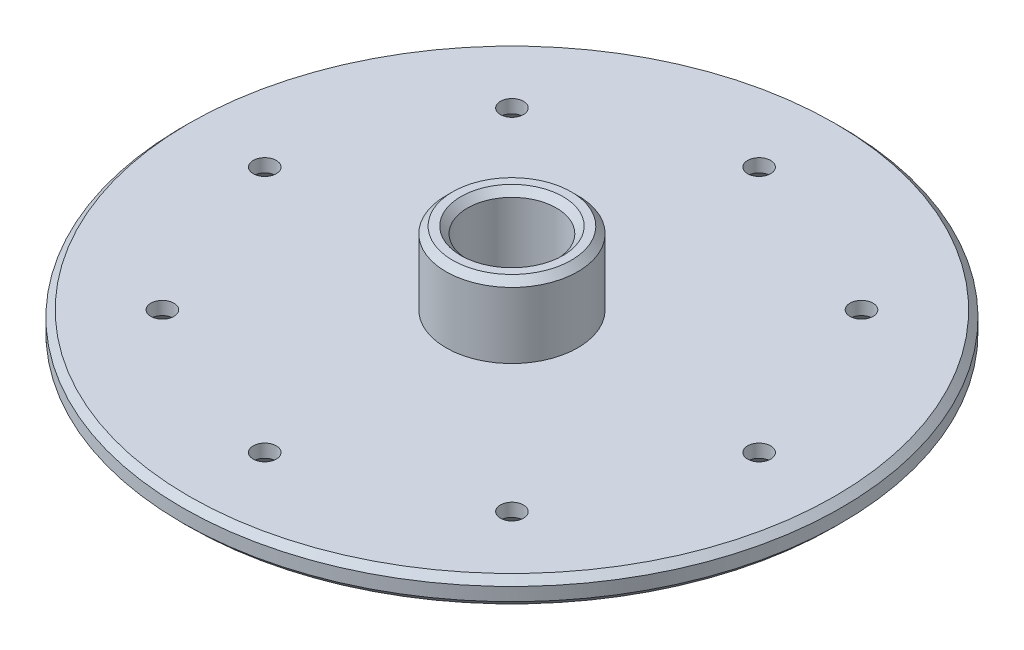
ISO-10303-21;
HEADER;
FILE_DESCRIPTION(('STEP AP214'),'2;1');
FILE_NAME('part.step','',(''),(''),'','','');
FILE_SCHEMA(('AUTOMOTIVE_DESIGN { 1 0 10303 214 1 1 1 1 }'));
ENDSEC;
DATA;
#1=APPLICATION_CONTEXT('core data for automotive mechanical design processes');
#2=APPLICATION_PROTOCOL_DEFINITION('international standard','automotive_design',2000,#1);
#3=PRODUCT_CONTEXT('',#1,'mechanical');
#4=PRODUCT('Part','Part','',(#3));
#5=PRODUCT_RELATED_PRODUCT_CATEGORY('part','',(#4));
#6=PRODUCT_DEFINITION_FORMATION('','',#4);
#7=PRODUCT_DEFINITION_CONTEXT('part definition',#1,'design');
#8=PRODUCT_DEFINITION('design','',#6,#7);
#9=PRODUCT_DEFINITION_SHAPE('','',#8);
#10=(LENGTH_UNIT() NAMED_UNIT(*) SI_UNIT(.MILLI.,.METRE.));
#11=(NAMED_UNIT(*) PLANE_ANGLE_UNIT() SI_UNIT($,.RADIAN.));
#12=(NAMED_UNIT(*) SI_UNIT($,.STERADIAN.) SOLID_ANGLE_UNIT());
#13=UNCERTAINTY_MEASURE_WITH_UNIT(LENGTH_MEASURE(1.E-05),#10,'distance_accuracy_value','');
#14=(GEOMETRIC_REPRESENTATION_CONTEXT(3) GLOBAL_UNCERTAINTY_ASSIGNED_CONTEXT((#13)) GLOBAL_UNIT_ASSIGNED_CONTEXT((#10,
#11,#12)) REPRESENTATION_CONTEXT('',''));
#15=CARTESIAN_POINT('',(0.,0.,0.));
#16=DIRECTION('',(0.,0.,1.));
#17=DIRECTION('',(1.,0.,0.));
#18=AXIS2_PLACEMENT_3D('',#15,#16,#17);
#19=CARTESIAN_POINT('',(0.,4.,9.99999999999998));
#20=DIRECTION('',(0.,1.,0.));
#21=DIRECTION('',(0.,0.,1.));
#22=AXIS2_PLACEMENT_3D('',#19,#20,#21);
#23=PLANE('',#22);
#24=CARTESIAN_POINT('',(0.,4.,-37.5));
#25=DIRECTION('',(0.,1.,0.));
#26=DIRECTION('',(0.,0.,1.));
#27=AXIS2_PLACEMENT_3D('',#24,#25,#26);
#28=CIRCLE('',#27,1.75);
#29=CARTESIAN_POINT('',(0.,4.,-35.75));
#30=VERTEX_POINT('',#29);
#31=EDGE_CURVE('E147',#30,#30,#28,.T.);
#32=ORIENTED_EDGE('',*,*,#31,.F.);
#33=EDGE_LOOP('',(#32));
#34=FACE_BOUND('',#33,.T.);
#35=CARTESIAN_POINT('',(26.5165042944955,4.,-26.5165042944955));
#36=DIRECTION('',(0.,1.,0.));
#37=DIRECTION('',(0.,0.,1.));
#38=AXIS2_PLACEMENT_3D('',#35,#36,#37);
#39=CIRCLE('',#38,1.75);
#40=CARTESIAN_POINT('',(26.5165042944955,4.,-24.7665042944955));
#41=VERTEX_POINT('',#40);
#42=EDGE_CURVE('E150',#41,#41,#39,.T.);
#43=ORIENTED_EDGE('',*,*,#42,.F.);
#44=EDGE_LOOP('',(#43));
#45=FACE_BOUND('',#44,.T.);
#46=CARTESIAN_POINT('',(37.5,4.,0.));
#47=DIRECTION('',(0.,1.,0.));
#48=DIRECTION('',(0.,0.,1.));
#49=AXIS2_PLACEMENT_3D('',#46,#47,#48);
#50=CIRCLE('',#49,1.75);
#51=CARTESIAN_POINT('',(37.5,4.,1.75));
#52=VERTEX_POINT('',#51);
#53=EDGE_CURVE('E153',#52,#52,#50,.T.);
#54=ORIENTED_EDGE('',*,*,#53,.F.);
#55=EDGE_LOOP('',(#54));
#56=FACE_BOUND('',#55,.T.);
#57=CARTESIAN_POINT('',(26.5165042944955,4.,26.5165042944955));
#58=DIRECTION('',(0.,1.,0.));
#59=DIRECTION('',(0.,0.,1.));
#60=AXIS2_PLACEMENT_3D('',#57,#58,#59);
#61=CIRCLE('',#60,1.75);
#62=CARTESIAN_POINT('',(26.5165042944955,4.,28.2665042944955));
#63=VERTEX_POINT('',#62);
#64=EDGE_CURVE('E156',#63,#63,#61,.T.);
#65=ORIENTED_EDGE('',*,*,#64,.F.);
#66=EDGE_LOOP('',(#65));
#67=FACE_BOUND('',#66,.T.);
#68=CARTESIAN_POINT('',(0.,4.,37.5));
#69=DIRECTION('',(0.,1.,0.));
#70=DIRECTION('',(0.,0.,1.));
#71=AXIS2_PLACEMENT_3D('',#68,#69,#70);
#72=CIRCLE('',#71,1.75);
#73=CARTESIAN_POINT('',(0.,4.,39.25));
#74=VERTEX_POINT('',#73);
#75=EDGE_CURVE('E159',#74,#74,#72,.T.);
#76=ORIENTED_EDGE('',*,*,#75,.F.);
#77=EDGE_LOOP('',(#76));
#78=FACE_BOUND('',#77,.T.);
#79=CARTESIAN_POINT('',(-26.5165042944955,4.,26.5165042944955));
#80=DIRECTION('',(0.,1.,0.));
#81=DIRECTION('',(0.,0.,1.));
#82=AXIS2_PLACEMENT_3D('',#79,#80,#81);
#83=CIRCLE('',#82,1.75);
#84=CARTESIAN_POINT('',(-26.5165042944955,4.,28.2665042944955));
#85=VERTEX_POINT('',#84);
#86=EDGE_CURVE('E162',#85,#85,#83,.T.);
#87=ORIENTED_EDGE('',*,*,#86,.F.);
#88=EDGE_LOOP('',(#87));
#89=FACE_BOUND('',#88,.T.);
#90=CARTESIAN_POINT('',(-37.5,4.,0.));
#91=DIRECTION('',(0.,1.,0.));
#92=DIRECTION('',(0.,0.,1.));
#93=AXIS2_PLACEMENT_3D('',#90,#91,#92);
#94=CIRCLE('',#93,1.75);
#95=CARTESIAN_POINT('',(-37.5,4.,1.75000000000001));
#96=VERTEX_POINT('',#95);
#97=EDGE_CURVE('E165',#96,#96,#94,.T.);
#98=ORIENTED_EDGE('',*,*,#97,.F.);
#99=EDGE_LOOP('',(#98));
#100=FACE_BOUND('',#99,.T.);
#101=CARTESIAN_POINT('',(-26.5165042944955,4.,-26.5165042944955));
#102=DIRECTION('',(0.,1.,0.));
#103=DIRECTION('',(0.,0.,1.));
#104=AXIS2_PLACEMENT_3D('',#101,#102,#103);
#105=CIRCLE('',#104,1.75);
#106=CARTESIAN_POINT('',(-26.5165042944955,4.,-24.7665042944955));
#107=VERTEX_POINT('',#106);
#108=EDGE_CURVE('E168',#107,#107,#105,.T.);
#109=ORIENTED_EDGE('',*,*,#108,.F.);
#110=EDGE_LOOP('',(#109));
#111=FACE_BOUND('',#110,.T.);
#112=CARTESIAN_POINT('',(0.,4.,0.));
#113=DIRECTION('',(0.,1.,0.));
#114=DIRECTION('',(0.,0.,1.));
#115=AXIS2_PLACEMENT_3D('',#112,#113,#114);
#116=CIRCLE('',#115,49.);
#117=CARTESIAN_POINT('',(0.,4.,49.));
#118=VERTEX_POINT('',#117);
#119=EDGE_CURVE('E90',#118,#118,#116,.T.);
#120=ORIENTED_EDGE('',*,*,#119,.T.);
#121=EDGE_LOOP('',(#120));
#122=FACE_BOUND('',#121,.T.);
#123=CARTESIAN_POINT('',(0.,4.,0.));
#124=DIRECTION('',(0.,1.,0.));
#125=DIRECTION('',(0.,0.,1.));
#126=AXIS2_PLACEMENT_3D('',#123,#124,#125);
#127=CIRCLE('',#126,9.99999999999998);
#128=CARTESIAN_POINT('',(0.,4.,9.99999999999998));
#129=VERTEX_POINT('',#128);
#130=EDGE_CURVE('E144',#129,#129,#127,.T.);
#131=ORIENTED_EDGE('',*,*,#130,.F.);
#132=EDGE_LOOP('',(#131));
#133=FACE_BOUND('',#132,.T.);
#134=ADVANCED_FACE('F33',(#34,#45,#56,#67,#78,#89,#100,#111,#122,#133),#23,.T.);
#135=CARTESIAN_POINT('',(0.,4.,0.));
#136=DIRECTION('',(0.,-1.,0.));
#137=DIRECTION('',(0.,0.,-1.));
#138=AXIS2_PLACEMENT_3D('',#135,#136,#137);
#139=CONICAL_SURFACE('',#138,49.,0.785398163397448);
#140=CARTESIAN_POINT('',(0.,3.,0.));
#141=DIRECTION('',(0.,1.,0.));
#142=DIRECTION('',(0.,0.,1.));
#143=AXIS2_PLACEMENT_3D('',#140,#141,#142);
#144=CIRCLE('',#143,50.);
#145=CARTESIAN_POINT('',(0.,3.,50.));
#146=VERTEX_POINT('',#145);
#147=EDGE_CURVE('E93',#146,#146,#144,.T.);
#148=ORIENTED_EDGE('',*,*,#147,.T.);
#149=EDGE_LOOP('',(#148));
#150=FACE_BOUND('',#149,.T.);
#151=ORIENTED_EDGE('',*,*,#119,.F.);
#152=EDGE_LOOP('',(#151));
#153=FACE_BOUND('',#152,.T.);
#154=ADVANCED_FACE('F176',(#150,#153),#139,.T.);
#155=CARTESIAN_POINT('',(0.,143.307692307691,0.));
#156=DIRECTION('',(0.,1.,0.));
#157=DIRECTION('',(0.,0.,1.));
#158=AXIS2_PLACEMENT_3D('',#155,#156,#157);
#159=CYLINDRICAL_SURFACE('',#158,50.);
#160=CARTESIAN_POINT('',(0.,1.,0.));
#161=DIRECTION('',(0.,1.,0.));
#162=DIRECTION('',(0.,0.,1.));
#163=AXIS2_PLACEMENT_3D('',#160,#161,#162);
#164=CIRCLE('',#163,50.);
#165=CARTESIAN_POINT('',(0.,1.,50.));
#166=VERTEX_POINT('',#165);
#167=EDGE_CURVE('E96',#166,#166,#164,.T.);
#168=ORIENTED_EDGE('',*,*,#167,.T.);
#169=EDGE_LOOP('',(#168));
#170=FACE_BOUND('',#169,.T.);
#171=ORIENTED_EDGE('',*,*,#147,.F.);
#172=EDGE_LOOP('',(#171));
#173=FACE_BOUND('',#172,.T.);
#174=ADVANCED_FACE('F277',(#170,#173),#159,.T.);
#175=CARTESIAN_POINT('',(0.,1.,0.));
#176=DIRECTION('',(0.,1.,0.));
#177=DIRECTION('',(0.,0.,1.));
#178=AXIS2_PLACEMENT_3D('',#175,#176,#177);
#179=CONICAL_SURFACE('',#178,50.,0.785398163397448);
#180=CARTESIAN_POINT('',(0.,0.,0.));
#181=DIRECTION('',(0.,1.,0.));
#182=DIRECTION('',(0.,0.,1.));
#183=AXIS2_PLACEMENT_3D('',#180,#181,#182);
#184=CIRCLE('',#183,49.);
#185=CARTESIAN_POINT('',(0.,0.,49.));
#186=VERTEX_POINT('',#185);
#187=EDGE_CURVE('E99',#186,#186,#184,.T.);
#188=ORIENTED_EDGE('',*,*,#187,.T.);
#189=EDGE_LOOP('',(#188));
#190=FACE_BOUND('',#189,.T.);
#191=ORIENTED_EDGE('',*,*,#167,.F.);
#192=EDGE_LOOP('',(#191));
#193=FACE_BOUND('',#192,.T.);
#194=ADVANCED_FACE('F270',(#190,#193),#179,.T.);
#195=CARTESIAN_POINT('',(0.,0.,49.));
#196=DIRECTION('',(0.,-1.,0.));
#197=DIRECTION('',(0.,0.,-1.));
#198=AXIS2_PLACEMENT_3D('',#195,#196,#197);
#199=PLANE('',#198);
#200=CARTESIAN_POINT('',(37.5,0.,0.));
#201=DIRECTION('',(0.,-1.,0.));
#202=DIRECTION('',(0.,0.,-1.));
#203=AXIS2_PLACEMENT_3D('',#200,#201,#202);
#204=CIRCLE('',#203,3.75000000000004);
#205=CARTESIAN_POINT('',(37.5,0.,-3.75000000000005));
#206=VERTEX_POINT('',#205);
#207=EDGE_CURVE('E63',#206,#206,#204,.F.);
#208=ORIENTED_EDGE('',*,*,#207,.T.);
#209=EDGE_LOOP('',(#208));
#210=FACE_BOUND('',#209,.T.);
#211=CARTESIAN_POINT('',(26.5165042944955,0.,26.5165042944955));
#212=DIRECTION('',(0.,-1.,0.));
#213=DIRECTION('',(0.,0.,-1.));
#214=AXIS2_PLACEMENT_3D('',#211,#212,#213);
#215=CIRCLE('',#214,3.75000000000004);
#216=CARTESIAN_POINT('',(26.5165042944955,0.,22.7665042944955));
#217=VERTEX_POINT('',#216);
#218=EDGE_CURVE('E66',#217,#217,#215,.F.);
#219=ORIENTED_EDGE('',*,*,#218,.T.);
#220=EDGE_LOOP('',(#219));
#221=FACE_BOUND('',#220,.T.);
#222=CARTESIAN_POINT('',(0.,0.,37.5));
#223=DIRECTION('',(0.,-1.,0.));
#224=DIRECTION('',(0.,0.,-1.));
#225=AXIS2_PLACEMENT_3D('',#222,#223,#224);
#226=CIRCLE('',#225,3.75000000000004);
#227=CARTESIAN_POINT('',(0.,0.,33.75));
#228=VERTEX_POINT('',#227);
#229=EDGE_CURVE('E69',#228,#228,#226,.F.);
#230=ORIENTED_EDGE('',*,*,#229,.T.);
#231=EDGE_LOOP('',(#230));
#232=FACE_BOUND('',#231,.T.);
#233=CARTESIAN_POINT('',(-26.5165042944955,0.,26.5165042944955));
#234=DIRECTION('',(0.,-1.,0.));
#235=DIRECTION('',(0.,0.,-1.));
#236=AXIS2_PLACEMENT_3D('',#233,#234,#235);
#237=CIRCLE('',#236,3.75000000000004);
#238=CARTESIAN_POINT('',(-26.5165042944955,0.,22.7665042944955));
#239=VERTEX_POINT('',#238);
#240=EDGE_CURVE('E72',#239,#239,#237,.F.);
#241=ORIENTED_EDGE('',*,*,#240,.T.);
#242=EDGE_LOOP('',(#241));
#243=FACE_BOUND('',#242,.T.);
#244=CARTESIAN_POINT('',(-37.5,0.,0.));
#245=DIRECTION('',(0.,-1.,0.));
#246=DIRECTION('',(0.,0.,-1.));
#247=AXIS2_PLACEMENT_3D('',#244,#245,#246);
#248=CIRCLE('',#247,3.75000000000004);
#249=CARTESIAN_POINT('',(-37.5,0.,-3.75000000000004));
#250=VERTEX_POINT('',#249);
#251=EDGE_CURVE('E75',#250,#250,#248,.F.);
#252=ORIENTED_EDGE('',*,*,#251,.T.);
#253=EDGE_LOOP('',(#252));
#254=FACE_BOUND('',#253,.T.);
#255=CARTESIAN_POINT('',(-26.5165042944955,0.,-26.5165042944955));
#256=DIRECTION('',(0.,-1.,0.));
#257=DIRECTION('',(0.,0.,-1.));
#258=AXIS2_PLACEMENT_3D('',#255,#256,#257);
#259=CIRCLE('',#258,3.75000000000004);
#260=CARTESIAN_POINT('',(-26.5165042944955,0.,-30.2665042944956));
#261=VERTEX_POINT('',#260);
#262=EDGE_CURVE('E78',#261,#261,#259,.F.);
#263=ORIENTED_EDGE('',*,*,#262,.T.);
#264=EDGE_LOOP('',(#263));
#265=FACE_BOUND('',#264,.T.);
#266=CARTESIAN_POINT('',(26.5165042944955,0.,-26.5165042944955));
#267=DIRECTION('',(0.,-1.,0.));
#268=DIRECTION('',(0.,0.,-1.));
#269=AXIS2_PLACEMENT_3D('',#266,#267,#268);
#270=CIRCLE('',#269,3.75000000000004);
#271=CARTESIAN_POINT('',(26.5165042944955,0.,-30.2665042944956));
#272=VERTEX_POINT('',#271);
#273=EDGE_CURVE('E81',#272,#272,#270,.F.);
#274=ORIENTED_EDGE('',*,*,#273,.T.);
#275=EDGE_LOOP('',(#274));
#276=FACE_BOUND('',#275,.T.);
#277=CARTESIAN_POINT('',(0.,0.,-37.5));
#278=DIRECTION('',(0.,-1.,0.));
#279=DIRECTION('',(0.,0.,-1.));
#280=AXIS2_PLACEMENT_3D('',#277,#278,#279);
#281=CIRCLE('',#280,3.75000000000004);
#282=CARTESIAN_POINT('',(0.,0.,-41.25));
#283=VERTEX_POINT('',#282);
#284=EDGE_CURVE('E84',#283,#283,#281,.F.);
#285=ORIENTED_EDGE('',*,*,#284,.T.);
#286=EDGE_LOOP('',(#285));
#287=FACE_BOUND('',#286,.T.);
#288=CARTESIAN_POINT('',(0.,0.,0.));
#289=DIRECTION('',(0.,1.,0.));
#290=DIRECTION('',(0.,0.,1.));
#291=AXIS2_PLACEMENT_3D('',#288,#289,#290);
#292=CIRCLE('',#291,19.);
#293=CARTESIAN_POINT('',(0.,0.,19.));
#294=VERTEX_POINT('',#293);
#295=EDGE_CURVE('E102',#294,#294,#292,.T.);
#296=ORIENTED_EDGE('',*,*,#295,.T.);
#297=EDGE_LOOP('',(#296));
#298=FACE_BOUND('',#297,.T.);
#299=ORIENTED_EDGE('',*,*,#187,.F.);
#300=EDGE_LOOP('',(#299));
#301=FACE_BOUND('',#300,.T.);
#302=ADVANCED_FACE('F264',(#210,#221,#232,#243,#254,#265,#276,#287,#298,#301),#199,.T.);
#303=CARTESIAN_POINT('',(0.,0.,0.));
#304=DIRECTION('',(0.,1.,0.));
#305=DIRECTION('',(0.,0.,1.));
#306=AXIS2_PLACEMENT_3D('',#303,#304,#305);
#307=CONICAL_SURFACE('',#306,19.,0.785398163397448);
#308=CARTESIAN_POINT('',(0.,-1.,0.));
#309=DIRECTION('',(0.,1.,0.));
#310=DIRECTION('',(0.,0.,1.));
#311=AXIS2_PLACEMENT_3D('',#308,#309,#310);
#312=CIRCLE('',#311,18.);
#313=CARTESIAN_POINT('',(0.,-1.,18.));
#314=VERTEX_POINT('',#313);
#315=EDGE_CURVE('E105',#314,#314,#312,.T.);
#316=ORIENTED_EDGE('',*,*,#315,.T.);
#317=EDGE_LOOP('',(#316));
#318=FACE_BOUND('',#317,.T.);
#319=ORIENTED_EDGE('',*,*,#295,.F.);
#320=EDGE_LOOP('',(#319));
#321=FACE_BOUND('',#320,.T.);
#322=ADVANCED_FACE('F258',(#318,#321),#307,.T.);
#323=CARTESIAN_POINT('',(0.,143.307692307691,0.));
#324=DIRECTION('',(0.,1.,0.));
#325=DIRECTION('',(0.,0.,1.));
#326=AXIS2_PLACEMENT_3D('',#323,#324,#325);
#327=CYLINDRICAL_SURFACE('',#326,18.);
#328=CARTESIAN_POINT('',(0.,-14.,0.));
#329=DIRECTION('',(0.,1.,0.));
#330=DIRECTION('',(0.,0.,1.));
#331=AXIS2_PLACEMENT_3D('',#328,#329,#330);
#332=CIRCLE('',#331,18.);
#333=CARTESIAN_POINT('',(0.,-14.,18.));
#334=VERTEX_POINT('',#333);
#335=EDGE_CURVE('E108',#334,#334,#332,.T.);
#336=ORIENTED_EDGE('',*,*,#335,.T.);
#337=EDGE_LOOP('',(#336));
#338=FACE_BOUND('',#337,.T.);
#339=ORIENTED_EDGE('',*,*,#315,.F.);
#340=EDGE_LOOP('',(#339));
#341=FACE_BOUND('',#340,.T.);
#342=ADVANCED_FACE('F252',(#338,#341),#327,.T.);
#343=CARTESIAN_POINT('',(0.,-14.,0.));
#344=DIRECTION('',(0.,1.,0.));
#345=DIRECTION('',(0.,0.,1.));
#346=AXIS2_PLACEMENT_3D('',#343,#344,#345);
#347=CONICAL_SURFACE('',#346,18.,0.785398163397448);
#348=CARTESIAN_POINT('',(0.,-15.,0.));
#349=DIRECTION('',(0.,1.,0.));
#350=DIRECTION('',(0.,0.,1.));
#351=AXIS2_PLACEMENT_3D('',#348,#349,#350);
#352=CIRCLE('',#351,17.);
#353=CARTESIAN_POINT('',(0.,-15.,17.));
#354=VERTEX_POINT('',#353);
#355=EDGE_CURVE('E111',#354,#354,#352,.T.);
#356=ORIENTED_EDGE('',*,*,#355,.T.);
#357=EDGE_LOOP('',(#356));
#358=FACE_BOUND('',#357,.T.);
#359=ORIENTED_EDGE('',*,*,#335,.F.);
#360=EDGE_LOOP('',(#359));
#361=FACE_BOUND('',#360,.T.);
#362=ADVANCED_FACE('F246',(#358,#361),#347,.T.);
#363=CARTESIAN_POINT('',(0.,-15.,17.));
#364=DIRECTION('',(0.,-1.,0.));
#365=DIRECTION('',(0.,0.,-1.));
#366=AXIS2_PLACEMENT_3D('',#363,#364,#365);
#367=PLANE('',#366);
#368=CARTESIAN_POINT('',(0.,-15.,0.));
#369=DIRECTION('',(0.,1.,0.));
#370=DIRECTION('',(0.,0.,1.));
#371=AXIS2_PLACEMENT_3D('',#368,#369,#370);
#372=CIRCLE('',#371,15.25);
#373=CARTESIAN_POINT('',(0.,-15.,15.25));
#374=VERTEX_POINT('',#373);
#375=EDGE_CURVE('E114',#374,#374,#372,.T.);
#376=ORIENTED_EDGE('',*,*,#375,.T.);
#377=EDGE_LOOP('',(#376));
#378=FACE_BOUND('',#377,.T.);
#379=ORIENTED_EDGE('',*,*,#355,.F.);
#380=EDGE_LOOP('',(#379));
#381=FACE_BOUND('',#380,.T.);
#382=ADVANCED_FACE('F240',(#378,#381),#367,.T.);
#383=CARTESIAN_POINT('',(0.,-15.,0.));
#384=DIRECTION('',(0.,-1.,0.));
#385=DIRECTION('',(0.,0.,-1.));
#386=AXIS2_PLACEMENT_3D('',#383,#384,#385);
#387=CONICAL_SURFACE('',#386,15.25,0.785398163397447);
#388=CARTESIAN_POINT('',(0.,-14.,0.));
#389=DIRECTION('',(0.,1.,0.));
#390=DIRECTION('',(0.,0.,1.));
#391=AXIS2_PLACEMENT_3D('',#388,#389,#390);
#392=CIRCLE('',#391,14.25);
#393=CARTESIAN_POINT('',(0.,-14.,14.25));
#394=VERTEX_POINT('',#393);
#395=EDGE_CURVE('E117',#394,#394,#392,.T.);
#396=ORIENTED_EDGE('',*,*,#395,.T.);
#397=EDGE_LOOP('',(#396));
#398=FACE_BOUND('',#397,.T.);
#399=ORIENTED_EDGE('',*,*,#375,.F.);
#400=EDGE_LOOP('',(#399));
#401=FACE_BOUND('',#400,.T.);
#402=ADVANCED_FACE('F234',(#398,#401),#387,.F.);
#403=CARTESIAN_POINT('',(0.,143.307692307691,0.));
#404=DIRECTION('',(0.,1.,0.));
#405=DIRECTION('',(0.,0.,1.));
#406=AXIS2_PLACEMENT_3D('',#403,#404,#405);
#407=CYLINDRICAL_SURFACE('',#406,14.25);
#408=CARTESIAN_POINT('',(0.,-5.09999999999999,0.));
#409=DIRECTION('',(0.,1.,0.));
#410=DIRECTION('',(0.,0.,1.));
#411=AXIS2_PLACEMENT_3D('',#408,#409,#410);
#412=CIRCLE('',#411,14.25);
#413=CARTESIAN_POINT('',(0.,-5.09999999999999,14.25));
#414=VERTEX_POINT('',#413);
#415=EDGE_CURVE('E120',#414,#414,#412,.T.);
#416=ORIENTED_EDGE('',*,*,#415,.T.);
#417=EDGE_LOOP('',(#416));
#418=FACE_BOUND('',#417,.T.);
#419=ORIENTED_EDGE('',*,*,#395,.F.);
#420=EDGE_LOOP('',(#419));
#421=FACE_BOUND('',#420,.T.);
#422=ADVANCED_FACE('F228',(#418,#421),#407,.F.);
#423=CARTESIAN_POINT('',(0.,-5.09999999999999,0.));
#424=DIRECTION('',(0.,-1.,0.));
#425=DIRECTION('',(0.,0.,-1.));
#426=AXIS2_PLACEMENT_3D('',#423,#424,#425);
#427=CONICAL_SURFACE('',#426,14.25,0.7853981633975);
#428=CARTESIAN_POINT('',(0.,-5.,0.));
#429=DIRECTION('',(0.,1.,0.));
#430=DIRECTION('',(0.,0.,1.));
#431=AXIS2_PLACEMENT_3D('',#428,#429,#430);
#432=CIRCLE('',#431,14.15);
#433=CARTESIAN_POINT('',(0.,-5.,14.15));
#434=VERTEX_POINT('',#433);
#435=EDGE_CURVE('E123',#434,#434,#432,.T.);
#436=ORIENTED_EDGE('',*,*,#435,.T.);
#437=EDGE_LOOP('',(#436));
#438=FACE_BOUND('',#437,.T.);
#439=ORIENTED_EDGE('',*,*,#415,.F.);
#440=EDGE_LOOP('',(#439));
#441=FACE_BOUND('',#440,.T.);
#442=ADVANCED_FACE('F222',(#438,#441),#427,.F.);
#443=CARTESIAN_POINT('',(0.,-5.,11.75));
#444=DIRECTION('',(0.,-1.,0.));
#445=DIRECTION('',(0.,0.,-1.));
#446=AXIS2_PLACEMENT_3D('',#443,#444,#445);
#447=PLANE('',#446);
#448=CARTESIAN_POINT('',(0.,-5.,0.));
#449=DIRECTION('',(0.,1.,0.));
#450=DIRECTION('',(0.,0.,1.));
#451=AXIS2_PLACEMENT_3D('',#448,#449,#450);
#452=CIRCLE('',#451,11.75);
#453=CARTESIAN_POINT('',(0.,-5.,11.75));
#454=VERTEX_POINT('',#453);
#455=EDGE_CURVE('E126',#454,#454,#452,.T.);
#456=ORIENTED_EDGE('',*,*,#455,.T.);
#457=EDGE_LOOP('',(#456));
#458=FACE_BOUND('',#457,.T.);
#459=ORIENTED_EDGE('',*,*,#435,.F.);
#460=EDGE_LOOP('',(#459));
#461=FACE_BOUND('',#460,.T.);
#462=ADVANCED_FACE('F216',(#458,#461),#447,.T.);
#463=CARTESIAN_POINT('',(0.,-5.,0.));
#464=DIRECTION('',(0.,-1.,0.));
#465=DIRECTION('',(0.,0.,-1.));
#466=AXIS2_PLACEMENT_3D('',#463,#464,#465);
#467=CONICAL_SURFACE('',#466,11.75,0.785398163397445);
#468=CARTESIAN_POINT('',(0.,0.,0.));
#469=DIRECTION('',(0.,1.,0.));
#470=DIRECTION('',(0.,0.,1.));
#471=AXIS2_PLACEMENT_3D('',#468,#469,#470);
#472=CIRCLE('',#471,6.74999999999998);
#473=CARTESIAN_POINT('',(0.,0.,6.74999999999998));
#474=VERTEX_POINT('',#473);
#475=EDGE_CURVE('E129',#474,#474,#472,.T.);
#476=ORIENTED_EDGE('',*,*,#475,.T.);
#477=EDGE_LOOP('',(#476));
#478=FACE_BOUND('',#477,.T.);
#479=ORIENTED_EDGE('',*,*,#455,.F.);
#480=EDGE_LOOP('',(#479));
#481=FACE_BOUND('',#480,.T.);
#482=ADVANCED_FACE('F210',(#478,#481),#467,.F.);
#483=CARTESIAN_POINT('',(0.,143.307692307691,0.));
#484=DIRECTION('',(0.,1.,0.));
#485=DIRECTION('',(0.,0.,1.));
#486=AXIS2_PLACEMENT_3D('',#483,#484,#485);
#487=CYLINDRICAL_SURFACE('',#486,6.74999999999998);
#488=CARTESIAN_POINT('',(0.,14.,0.));
#489=DIRECTION('',(0.,1.,0.));
#490=DIRECTION('',(0.,0.,1.));
#491=AXIS2_PLACEMENT_3D('',#488,#489,#490);
#492=CIRCLE('',#491,6.74999999999998);
#493=CARTESIAN_POINT('',(0.,14.,6.74999999999998));
#494=VERTEX_POINT('',#493);
#495=EDGE_CURVE('E132',#494,#494,#492,.T.);
#496=ORIENTED_EDGE('',*,*,#495,.T.);
#497=EDGE_LOOP('',(#496));
#498=FACE_BOUND('',#497,.T.);
#499=ORIENTED_EDGE('',*,*,#475,.F.);
#500=EDGE_LOOP('',(#499));
#501=FACE_BOUND('',#500,.T.);
#502=ADVANCED_FACE('F204',(#498,#501),#487,.F.);
#503=CARTESIAN_POINT('',(0.,14.,0.));
#504=DIRECTION('',(0.,1.,0.));
#505=DIRECTION('',(0.,0.,1.));
#506=AXIS2_PLACEMENT_3D('',#503,#504,#505);
#507=CONICAL_SURFACE('',#506,6.74999999999998,0.785398163397448);
#508=CARTESIAN_POINT('',(0.,15.,0.));
#509=DIRECTION('',(0.,1.,0.));
#510=DIRECTION('',(0.,0.,1.));
#511=AXIS2_PLACEMENT_3D('',#508,#509,#510);
#512=CIRCLE('',#511,7.74999999999998);
#513=CARTESIAN_POINT('',(0.,15.,7.74999999999998));
#514=VERTEX_POINT('',#513);
#515=EDGE_CURVE('E135',#514,#514,#512,.T.);
#516=ORIENTED_EDGE('',*,*,#515,.T.);
#517=EDGE_LOOP('',(#516));
#518=FACE_BOUND('',#517,.T.);
#519=ORIENTED_EDGE('',*,*,#495,.F.);
#520=EDGE_LOOP('',(#519));
#521=FACE_BOUND('',#520,.T.);
#522=ADVANCED_FACE('F198',(#518,#521),#507,.F.);
#523=CARTESIAN_POINT('',(0.,15.,7.74999999999998));
#524=DIRECTION('',(0.,1.,0.));
#525=DIRECTION('',(0.,0.,1.));
#526=AXIS2_PLACEMENT_3D('',#523,#524,#525);
#527=PLANE('',#526);
#528=CARTESIAN_POINT('',(0.,15.,0.));
#529=DIRECTION('',(0.,1.,0.));
#530=DIRECTION('',(0.,0.,1.));
#531=AXIS2_PLACEMENT_3D('',#528,#529,#530);
#532=CIRCLE('',#531,8.99999999999999);
#533=CARTESIAN_POINT('',(0.,15.,8.99999999999999));
#534=VERTEX_POINT('',#533);
#535=EDGE_CURVE('E138',#534,#534,#532,.T.);
#536=ORIENTED_EDGE('',*,*,#535,.T.);
#537=EDGE_LOOP('',(#536));
#538=FACE_BOUND('',#537,.T.);
#539=ORIENTED_EDGE('',*,*,#515,.F.);
#540=EDGE_LOOP('',(#539));
#541=FACE_BOUND('',#540,.T.);
#542=ADVANCED_FACE('F192',(#538,#541),#527,.T.);
#543=CARTESIAN_POINT('',(0.,15.,0.));
#544=DIRECTION('',(0.,-1.,0.));
#545=DIRECTION('',(0.,0.,-1.));
#546=AXIS2_PLACEMENT_3D('',#543,#544,#545);
#547=CONICAL_SURFACE('',#546,8.99999999999999,0.785398163397447);
#548=CARTESIAN_POINT('',(0.,14.,0.));
#549=DIRECTION('',(0.,1.,0.));
#550=DIRECTION('',(0.,0.,1.));
#551=AXIS2_PLACEMENT_3D('',#548,#549,#550);
#552=CIRCLE('',#551,9.99999999999998);
#553=CARTESIAN_POINT('',(0.,14.,9.99999999999998));
#554=VERTEX_POINT('',#553);
#555=EDGE_CURVE('E141',#554,#554,#552,.T.);
#556=ORIENTED_EDGE('',*,*,#555,.T.);
#557=EDGE_LOOP('',(#556));
#558=FACE_BOUND('',#557,.T.);
#559=ORIENTED_EDGE('',*,*,#535,.F.);
#560=EDGE_LOOP('',(#559));
#561=FACE_BOUND('',#560,.T.);
#562=ADVANCED_FACE('F186',(#558,#561),#547,.T.);
#563=CARTESIAN_POINT('',(0.,143.307692307691,0.));
#564=DIRECTION('',(0.,1.,0.));
#565=DIRECTION('',(0.,0.,1.));
#566=AXIS2_PLACEMENT_3D('',#563,#564,#565);
#567=CYLINDRICAL_SURFACE('',#566,9.99999999999998);
#568=ORIENTED_EDGE('',*,*,#130,.T.);
#569=EDGE_LOOP('',(#568));
#570=FACE_BOUND('',#569,.T.);
#571=ORIENTED_EDGE('',*,*,#555,.F.);
#572=EDGE_LOOP('',(#571));
#573=FACE_BOUND('',#572,.T.);
#574=ADVANCED_FACE('F183',(#570,#573),#567,.T.);
#575=CARTESIAN_POINT('',(-26.5165042944955,-15.,-26.5165042944955));
#576=DIRECTION('',(0.,1.,0.));
#577=DIRECTION('',(0.,0.,1.));
#578=AXIS2_PLACEMENT_3D('',#575,#576,#577);
#579=CYLINDRICAL_SURFACE('',#578,1.75);
#580=CARTESIAN_POINT('',(-26.5165042944955,2.00000000000004,-26.5165042944955));
#581=DIRECTION('',(0.,-1.,0.));
#582=DIRECTION('',(0.,0.,-1.));
#583=AXIS2_PLACEMENT_3D('',#580,#581,#582);
#584=CIRCLE('',#583,1.75);
#585=CARTESIAN_POINT('',(-26.5165042944955,2.00000000000004,-28.2665042944955));
#586=VERTEX_POINT('',#585);
#587=EDGE_CURVE('E45',#586,#586,#584,.T.);
#588=ORIENTED_EDGE('',*,*,#587,.T.);
#589=EDGE_LOOP('',(#588));
#590=FACE_BOUND('',#589,.T.);
#591=ORIENTED_EDGE('',*,*,#108,.T.);
#592=EDGE_LOOP('',(#591));
#593=FACE_BOUND('',#592,.T.);
#594=ADVANCED_FACE('F172',(#590,#593),#579,.F.);
#595=CARTESIAN_POINT('',(-37.5,-15.,0.));
#596=DIRECTION('',(0.,1.,0.));
#597=DIRECTION('',(0.,0.,1.));
#598=AXIS2_PLACEMENT_3D('',#595,#596,#597);
#599=CYLINDRICAL_SURFACE('',#598,1.75);
#600=CARTESIAN_POINT('',(-37.5,2.00000000000003,0.));
#601=DIRECTION('',(0.,-1.,0.));
#602=DIRECTION('',(0.,0.,-1.));
#603=AXIS2_PLACEMENT_3D('',#600,#601,#602);
#604=CIRCLE('',#603,1.75);
#605=CARTESIAN_POINT('',(-37.5,2.00000000000003,-1.75));
#606=VERTEX_POINT('',#605);
#607=EDGE_CURVE('E49',#606,#606,#604,.T.);
#608=ORIENTED_EDGE('',*,*,#607,.T.);
#609=EDGE_LOOP('',(#608));
#610=FACE_BOUND('',#609,.T.);
#611=ORIENTED_EDGE('',*,*,#97,.T.);
#612=EDGE_LOOP('',(#611));
#613=FACE_BOUND('',#612,.T.);
#614=ADVANCED_FACE('F449',(#610,#613),#599,.F.);
#615=CARTESIAN_POINT('',(-26.5165042944955,-15.,26.5165042944955));
#616=DIRECTION('',(0.,1.,0.));
#617=DIRECTION('',(0.,0.,1.));
#618=AXIS2_PLACEMENT_3D('',#615,#616,#617);
#619=CYLINDRICAL_SURFACE('',#618,1.75);
#620=CARTESIAN_POINT('',(-26.5165042944955,2.00000000000004,26.5165042944955));
#621=DIRECTION('',(0.,-1.,0.));
#622=DIRECTION('',(0.,0.,-1.));
#623=AXIS2_PLACEMENT_3D('',#620,#621,#622);
#624=CIRCLE('',#623,1.75);
#625=CARTESIAN_POINT('',(-26.5165042944955,2.00000000000004,24.7665042944955));
#626=VERTEX_POINT('',#625);
#627=EDGE_CURVE('E54',#626,#626,#624,.T.);
#628=ORIENTED_EDGE('',*,*,#627,.T.);
#629=EDGE_LOOP('',(#628));
#630=FACE_BOUND('',#629,.T.);
#631=ORIENTED_EDGE('',*,*,#86,.T.);
#632=EDGE_LOOP('',(#631));
#633=FACE_BOUND('',#632,.T.);
#634=ADVANCED_FACE('F439',(#630,#633),#619,.F.);
#635=CARTESIAN_POINT('',(0.,-15.,37.5));
#636=DIRECTION('',(0.,1.,0.));
#637=DIRECTION('',(0.,0.,1.));
#638=AXIS2_PLACEMENT_3D('',#635,#636,#637);
#639=CYLINDRICAL_SURFACE('',#638,1.75);
#640=CARTESIAN_POINT('',(0.,2.00000000000004,37.5));
#641=DIRECTION('',(0.,-1.,0.));
#642=DIRECTION('',(0.,0.,-1.));
#643=AXIS2_PLACEMENT_3D('',#640,#641,#642);
#644=CIRCLE('',#643,1.75);
#645=CARTESIAN_POINT('',(0.,2.00000000000004,35.75));
#646=VERTEX_POINT('',#645);
#647=EDGE_CURVE('E57',#646,#646,#644,.T.);
#648=ORIENTED_EDGE('',*,*,#647,.T.);
#649=EDGE_LOOP('',(#648));
#650=FACE_BOUND('',#649,.T.);
#651=ORIENTED_EDGE('',*,*,#75,.T.);
#652=EDGE_LOOP('',(#651));
#653=FACE_BOUND('',#652,.T.);
#654=ADVANCED_FACE('F429',(#650,#653),#639,.F.);
#655=CARTESIAN_POINT('',(26.5165042944955,-15.,26.5165042944955));
#656=DIRECTION('',(0.,1.,0.));
#657=DIRECTION('',(0.,0.,1.));
#658=AXIS2_PLACEMENT_3D('',#655,#656,#657);
#659=CYLINDRICAL_SURFACE('',#658,1.75);
#660=CARTESIAN_POINT('',(26.5165042944955,2.00000000000004,26.5165042944955));
#661=DIRECTION('',(0.,-1.,0.));
#662=DIRECTION('',(0.,0.,-1.));
#663=AXIS2_PLACEMENT_3D('',#660,#661,#662);
#664=CIRCLE('',#663,1.75);
#665=CARTESIAN_POINT('',(26.5165042944955,2.00000000000004,24.7665042944955));
#666=VERTEX_POINT('',#665);
#667=EDGE_CURVE('E60',#666,#666,#664,.T.);
#668=ORIENTED_EDGE('',*,*,#667,.T.);
#669=EDGE_LOOP('',(#668));
#670=FACE_BOUND('',#669,.T.);
#671=ORIENTED_EDGE('',*,*,#64,.T.);
#672=EDGE_LOOP('',(#671));
#673=FACE_BOUND('',#672,.T.);
#674=ADVANCED_FACE('F419',(#670,#673),#659,.F.);
#675=CARTESIAN_POINT('',(37.5,-15.,0.));
#676=DIRECTION('',(0.,1.,0.));
#677=DIRECTION('',(0.,0.,1.));
#678=AXIS2_PLACEMENT_3D('',#675,#676,#677);
#679=CYLINDRICAL_SURFACE('',#678,1.75);
#680=CARTESIAN_POINT('',(37.5,2.00000000000003,0.));
#681=DIRECTION('',(0.,-1.,0.));
#682=DIRECTION('',(0.,0.,-1.));
#683=AXIS2_PLACEMENT_3D('',#680,#681,#682);
#684=CIRCLE('',#683,1.75);
#685=CARTESIAN_POINT('',(37.5,2.00000000000003,-1.75000000000001));
#686=VERTEX_POINT('',#685);
#687=EDGE_CURVE('E87',#686,#686,#684,.T.);
#688=ORIENTED_EDGE('',*,*,#687,.T.);
#689=EDGE_LOOP('',(#688));
#690=FACE_BOUND('',#689,.T.);
#691=ORIENTED_EDGE('',*,*,#53,.T.);
#692=EDGE_LOOP('',(#691));
#693=FACE_BOUND('',#692,.T.);
#694=ADVANCED_FACE('F410',(#690,#693),#679,.F.);
#695=CARTESIAN_POINT('',(26.5165042944955,-15.,-26.5165042944955));
#696=DIRECTION('',(0.,1.,0.));
#697=DIRECTION('',(0.,0.,1.));
#698=AXIS2_PLACEMENT_3D('',#695,#696,#697);
#699=CYLINDRICAL_SURFACE('',#698,1.75);
#700=CARTESIAN_POINT('',(26.5165042944955,2.00000000000004,-26.5165042944955));
#701=DIRECTION('',(0.,-1.,0.));
#702=DIRECTION('',(0.,0.,-1.));
#703=AXIS2_PLACEMENT_3D('',#700,#701,#702);
#704=CIRCLE('',#703,1.75);
#705=CARTESIAN_POINT('',(26.5165042944955,2.00000000000004,-28.2665042944955));
#706=VERTEX_POINT('',#705);
#707=EDGE_CURVE('E41',#706,#706,#704,.T.);
#708=ORIENTED_EDGE('',*,*,#707,.T.);
#709=EDGE_LOOP('',(#708));
#710=FACE_BOUND('',#709,.T.);
#711=ORIENTED_EDGE('',*,*,#42,.T.);
#712=EDGE_LOOP('',(#711));
#713=FACE_BOUND('',#712,.T.);
#714=ADVANCED_FACE('F401',(#710,#713),#699,.F.);
#715=CARTESIAN_POINT('',(0.,-15.,-37.5));
#716=DIRECTION('',(0.,1.,0.));
#717=DIRECTION('',(0.,0.,1.));
#718=AXIS2_PLACEMENT_3D('',#715,#716,#717);
#719=CYLINDRICAL_SURFACE('',#718,1.75);
#720=CARTESIAN_POINT('',(0.,2.00000000000004,-37.5));
#721=DIRECTION('',(0.,-1.,0.));
#722=DIRECTION('',(0.,0.,-1.));
#723=AXIS2_PLACEMENT_3D('',#720,#721,#722);
#724=CIRCLE('',#723,1.75);
#725=CARTESIAN_POINT('',(0.,2.00000000000004,-39.25));
#726=VERTEX_POINT('',#725);
#727=EDGE_CURVE('E10',#726,#726,#724,.T.);
#728=ORIENTED_EDGE('',*,*,#727,.T.);
#729=EDGE_LOOP('',(#728));
#730=FACE_BOUND('',#729,.T.);
#731=ORIENTED_EDGE('',*,*,#31,.T.);
#732=EDGE_LOOP('',(#731));
#733=FACE_BOUND('',#732,.T.);
#734=ADVANCED_FACE('F300',(#730,#733),#719,.F.);
#735=CARTESIAN_POINT('',(37.5,2.00000000000003,0.));
#736=DIRECTION('',(0.,-1.,0.));
#737=DIRECTION('',(0.,0.,-1.));
#738=AXIS2_PLACEMENT_3D('',#735,#736,#737);
#739=CONICAL_SURFACE('',#738,1.75,0.78539816339745);
#740=ORIENTED_EDGE('',*,*,#207,.F.);
#741=EDGE_LOOP('',(#740));
#742=FACE_BOUND('',#741,.T.);
#743=ORIENTED_EDGE('',*,*,#687,.F.);
#744=EDGE_LOOP('',(#743));
#745=FACE_BOUND('',#744,.T.);
#746=ADVANCED_FACE('F293',(#742,#745),#739,.F.);
#747=CARTESIAN_POINT('',(26.5165042944955,2.00000000000004,26.5165042944955));
#748=DIRECTION('',(0.,-1.,0.));
#749=DIRECTION('',(0.,0.,-1.));
#750=AXIS2_PLACEMENT_3D('',#747,#748,#749);
#751=CONICAL_SURFACE('',#750,1.75,0.78539816339745);
#752=ORIENTED_EDGE('',*,*,#218,.F.);
#753=EDGE_LOOP('',(#752));
#754=FACE_BOUND('',#753,.T.);
#755=ORIENTED_EDGE('',*,*,#667,.F.);
#756=EDGE_LOOP('',(#755));
#757=FACE_BOUND('',#756,.T.);
#758=ADVANCED_FACE('F299',(#754,#757),#751,.F.);
#759=CARTESIAN_POINT('',(0.,2.00000000000004,37.5));
#760=DIRECTION('',(0.,-1.,0.));
#761=DIRECTION('',(0.,0.,-1.));
#762=AXIS2_PLACEMENT_3D('',#759,#760,#761);
#763=CONICAL_SURFACE('',#762,1.75,0.78539816339745);
#764=ORIENTED_EDGE('',*,*,#229,.F.);
#765=EDGE_LOOP('',(#764));
#766=FACE_BOUND('',#765,.T.);
#767=ORIENTED_EDGE('',*,*,#647,.F.);
#768=EDGE_LOOP('',(#767));
#769=FACE_BOUND('',#768,.T.);
#770=ADVANCED_FACE('F307',(#766,#769),#763,.F.);
#771=CARTESIAN_POINT('',(-26.5165042944955,2.00000000000004,26.5165042944955));
#772=DIRECTION('',(0.,-1.,0.));
#773=DIRECTION('',(0.,0.,-1.));
#774=AXIS2_PLACEMENT_3D('',#771,#772,#773);
#775=CONICAL_SURFACE('',#774,1.75,0.78539816339745);
#776=ORIENTED_EDGE('',*,*,#240,.F.);
#777=EDGE_LOOP('',(#776));
#778=FACE_BOUND('',#777,.T.);
#779=ORIENTED_EDGE('',*,*,#627,.F.);
#780=EDGE_LOOP('',(#779));
#781=FACE_BOUND('',#780,.T.);
#782=ADVANCED_FACE('F314',(#778,#781),#775,.F.);
#783=CARTESIAN_POINT('',(-37.5,2.00000000000003,0.));
#784=DIRECTION('',(0.,-1.,0.));
#785=DIRECTION('',(0.,0.,-1.));
#786=AXIS2_PLACEMENT_3D('',#783,#784,#785);
#787=CONICAL_SURFACE('',#786,1.75,0.78539816339745);
#788=ORIENTED_EDGE('',*,*,#251,.F.);
#789=EDGE_LOOP('',(#788));
#790=FACE_BOUND('',#789,.T.);
#791=ORIENTED_EDGE('',*,*,#607,.F.);
#792=EDGE_LOOP('',(#791));
#793=FACE_BOUND('',#792,.T.);
#794=ADVANCED_FACE('F321',(#790,#793),#787,.F.);
#795=CARTESIAN_POINT('',(-26.5165042944955,2.00000000000004,-26.5165042944955));
#796=DIRECTION('',(0.,-1.,0.));
#797=DIRECTION('',(0.,0.,-1.));
#798=AXIS2_PLACEMENT_3D('',#795,#796,#797);
#799=CONICAL_SURFACE('',#798,1.75,0.78539816339745);
#800=ORIENTED_EDGE('',*,*,#262,.F.);
#801=EDGE_LOOP('',(#800));
#802=FACE_BOUND('',#801,.T.);
#803=ORIENTED_EDGE('',*,*,#587,.F.);
#804=EDGE_LOOP('',(#803));
#805=FACE_BOUND('',#804,.T.);
#806=ADVANCED_FACE('F328',(#802,#805),#799,.F.);
#807=CARTESIAN_POINT('',(26.5165042944955,2.00000000000004,-26.5165042944955));
#808=DIRECTION('',(0.,-1.,0.));
#809=DIRECTION('',(0.,0.,-1.));
#810=AXIS2_PLACEMENT_3D('',#807,#808,#809);
#811=CONICAL_SURFACE('',#810,1.75,0.78539816339745);
#812=ORIENTED_EDGE('',*,*,#273,.F.);
#813=EDGE_LOOP('',(#812));
#814=FACE_BOUND('',#813,.T.);
#815=ORIENTED_EDGE('',*,*,#707,.F.);
#816=EDGE_LOOP('',(#815));
#817=FACE_BOUND('',#816,.T.);
#818=ADVANCED_FACE('F334',(#814,#817),#811,.F.);
#819=CARTESIAN_POINT('',(0.,2.00000000000004,-37.5));
#820=DIRECTION('',(0.,-1.,0.));
#821=DIRECTION('',(0.,0.,-1.));
#822=AXIS2_PLACEMENT_3D('',#819,#820,#821);
#823=CONICAL_SURFACE('',#822,1.75,0.78539816339745);
#824=ORIENTED_EDGE('',*,*,#284,.F.);
#825=EDGE_LOOP('',(#824));
#826=FACE_BOUND('',#825,.T.);
#827=ORIENTED_EDGE('',*,*,#727,.F.);
#828=EDGE_LOOP('',(#827));
#829=FACE_BOUND('',#828,.T.);
#830=ADVANCED_FACE('F36',(#826,#829),#823,.F.);
#831=CLOSED_SHELL('',(#134,#154,#174,#194,#302,#322,#342,#362,#382,#402,#422,#442,#462,#482,
#502,#522,#542,#562,#574,#594,#614,#634,#654,#674,#694,#714,#734,#746,#758,#770,#782,#794,#806,
#818,#830));
#832=MANIFOLD_SOLID_BREP('B2',#831);
#833=ADVANCED_BREP_SHAPE_REPRESENTATION('',(#18,#832),#14);
#834=SHAPE_DEFINITION_REPRESENTATION(#9,#833);
ENDSEC;
END-ISO-10303-21;
